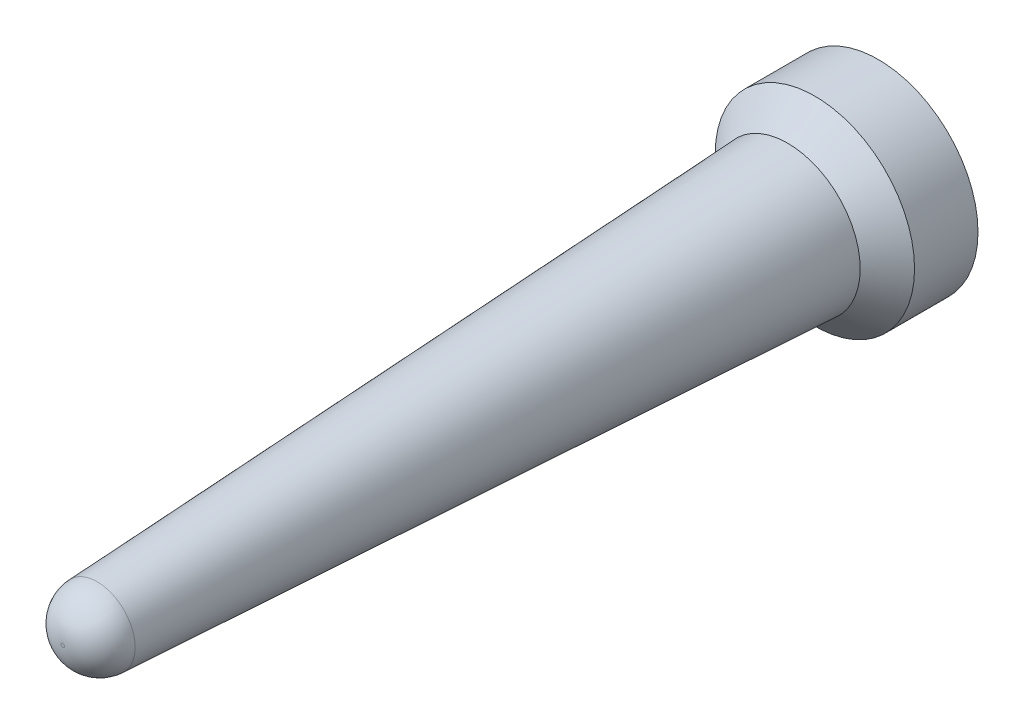
ISO-10303-21;
HEADER;
FILE_DESCRIPTION(('STEP AP214'),'2;1');
FILE_NAME('part.step','',(''),(''),'','','');
FILE_SCHEMA(('AUTOMOTIVE_DESIGN { 1 0 10303 214 1 1 1 1 }'));
ENDSEC;
DATA;
#1=APPLICATION_CONTEXT('core data for automotive mechanical design processes');
#2=APPLICATION_PROTOCOL_DEFINITION('international standard','automotive_design',2000,#1);
#3=PRODUCT_CONTEXT('',#1,'mechanical');
#4=PRODUCT('Part','Part','',(#3));
#5=PRODUCT_RELATED_PRODUCT_CATEGORY('part','',(#4));
#6=PRODUCT_DEFINITION_FORMATION('','',#4);
#7=PRODUCT_DEFINITION_CONTEXT('part definition',#1,'design');
#8=PRODUCT_DEFINITION('design','',#6,#7);
#9=PRODUCT_DEFINITION_SHAPE('','',#8);
#10=(LENGTH_UNIT() NAMED_UNIT(*) SI_UNIT(.MILLI.,.METRE.));
#11=(NAMED_UNIT(*) PLANE_ANGLE_UNIT() SI_UNIT($,.RADIAN.));
#12=(NAMED_UNIT(*) SI_UNIT($,.STERADIAN.) SOLID_ANGLE_UNIT());
#13=UNCERTAINTY_MEASURE_WITH_UNIT(LENGTH_MEASURE(1.E-05),#10,'distance_accuracy_value','');
#14=(GEOMETRIC_REPRESENTATION_CONTEXT(3) GLOBAL_UNCERTAINTY_ASSIGNED_CONTEXT((#13)) GLOBAL_UNIT_ASSIGNED_CONTEXT((#10,
#11,#12)) REPRESENTATION_CONTEXT('',''));
#15=CARTESIAN_POINT('',(0.,0.,0.));
#16=DIRECTION('',(0.,0.,1.));
#17=DIRECTION('',(1.,0.,0.));
#18=AXIS2_PLACEMENT_3D('',#15,#16,#17);
#19=CARTESIAN_POINT('',(0.,0.,0.));
#20=DIRECTION('',(0.,0.,-1.));
#21=DIRECTION('',(-1.,0.,0.));
#22=AXIS2_PLACEMENT_3D('',#19,#20,#21);
#23=PLANE('',#22);
#24=CARTESIAN_POINT('',(0.,0.,0.));
#25=DIRECTION('',(0.,0.,1.));
#26=DIRECTION('',(1.,0.,0.));
#27=AXIS2_PLACEMENT_3D('',#24,#25,#26);
#28=CIRCLE('',#27,0.2794);
#29=CARTESIAN_POINT('',(0.2794,0.,0.));
#30=VERTEX_POINT('',#29);
#31=EDGE_CURVE('E10',#30,#30,#28,.T.);
#32=ORIENTED_EDGE('',*,*,#31,.F.);
#33=EDGE_LOOP('',(#32));
#34=FACE_BOUND('',#33,.T.);
#35=ADVANCED_FACE('F35',(#34),#23,.T.);
#36=CARTESIAN_POINT('',(0.,0.,2.286));
#37=DIRECTION('',(0.,0.,1.));
#38=DIRECTION('',(1.,0.,0.));
#39=AXIS2_PLACEMENT_3D('',#36,#37,#38);
#40=CYLINDRICAL_SURFACE('',#39,0.2794);
#41=ORIENTED_EDGE('',*,*,#31,.T.);
#42=EDGE_LOOP('',(#41));
#43=FACE_BOUND('',#42,.T.);
#44=CARTESIAN_POINT('',(0.,0.,0.1778));
#45=DIRECTION('',(0.,0.,1.));
#46=DIRECTION('',(1.,0.,0.));
#47=AXIS2_PLACEMENT_3D('',#44,#45,#46);
#48=CIRCLE('',#47,0.2794);
#49=CARTESIAN_POINT('',(0.2794,0.,0.1778));
#50=VERTEX_POINT('',#49);
#51=EDGE_CURVE('E41',#50,#50,#48,.T.);
#52=ORIENTED_EDGE('',*,*,#51,.F.);
#53=EDGE_LOOP('',(#52));
#54=FACE_BOUND('',#53,.T.);
#55=ADVANCED_FACE('F74',(#43,#54),#40,.T.);
#56=CARTESIAN_POINT('',(0.,0.,0.254));
#57=DIRECTION('',(0.,0.,-1.));
#58=DIRECTION('',(-1.,0.,0.));
#59=AXIS2_PLACEMENT_3D('',#56,#57,#58);
#60=CONICAL_SURFACE('',#59,0.2032,0.785398163397447);
#61=ORIENTED_EDGE('',*,*,#51,.T.);
#62=EDGE_LOOP('',(#61));
#63=FACE_BOUND('',#62,.T.);
#64=CARTESIAN_POINT('',(0.,0.,0.254));
#65=DIRECTION('',(0.,0.,1.));
#66=DIRECTION('',(1.,0.,0.));
#67=AXIS2_PLACEMENT_3D('',#64,#65,#66);
#68=CIRCLE('',#67,0.2032);
#69=CARTESIAN_POINT('',(0.2032,0.,0.254));
#70=VERTEX_POINT('',#69);
#71=EDGE_CURVE('E45',#70,#70,#68,.T.);
#72=ORIENTED_EDGE('',*,*,#71,.F.);
#73=EDGE_LOOP('',(#72));
#74=FACE_BOUND('',#73,.T.);
#75=ADVANCED_FACE('F70',(#63,#74),#60,.T.);
#76=CARTESIAN_POINT('',(0.,0.,2.1894736618815));
#77=DIRECTION('',(0.,0.,-1.));
#78=DIRECTION('',(-1.,0.,0.));
#79=AXIS2_PLACEMENT_3D('',#76,#77,#78);
#80=CONICAL_SURFACE('',#79,0.106426316905925,0.0499583957219428);
#81=ORIENTED_EDGE('',*,*,#71,.T.);
#82=EDGE_LOOP('',(#81));
#83=FACE_BOUND('',#82,.T.);
#84=CARTESIAN_POINT('',(0.,0.,2.1894736618815));
#85=DIRECTION('',(0.,0.,1.));
#86=DIRECTION('',(1.,0.,0.));
#87=AXIS2_PLACEMENT_3D('',#84,#85,#86);
#88=CIRCLE('',#87,0.106426316905925);
#89=CARTESIAN_POINT('',(0.106426316905925,0.,2.1894736618815));
#90=VERTEX_POINT('',#89);
#91=EDGE_CURVE('E49',#90,#90,#88,.T.);
#92=ORIENTED_EDGE('',*,*,#91,.F.);
#93=EDGE_LOOP('',(#92));
#94=FACE_BOUND('',#93,.T.);
#95=ADVANCED_FACE('F62',(#83,#94),#80,.T.);
#96=CARTESIAN_POINT('',(0.,0.,2.1844));
#97=DIRECTION('',(0.,0.,1.));
#98=DIRECTION('',(1.,0.,0.));
#99=AXIS2_PLACEMENT_3D('',#96,#97,#98);
#100=DEGENERATE_TOROIDAL_SURFACE('',#99,0.00495307927593601,0.1016,.T.);
#101=ORIENTED_EDGE('',*,*,#91,.T.);
#102=EDGE_LOOP('',(#101));
#103=FACE_BOUND('',#102,.T.);
#104=CARTESIAN_POINT('',(0.,0.,2.286));
#105=DIRECTION('',(0.,0.,1.));
#106=DIRECTION('',(1.,0.,0.));
#107=AXIS2_PLACEMENT_3D('',#104,#105,#106);
#108=CIRCLE('',#107,0.00495307927593539);
#109=CARTESIAN_POINT('',(0.00495307927593539,0.,2.286));
#110=VERTEX_POINT('',#109);
#111=EDGE_CURVE('E54',#110,#110,#108,.T.);
#112=ORIENTED_EDGE('',*,*,#111,.F.);
#113=EDGE_LOOP('',(#112));
#114=FACE_BOUND('',#113,.T.);
#115=ADVANCED_FACE('F60',(#103,#114),#100,.T.);
#116=CARTESIAN_POINT('',(0.00495307927593535,0.,2.286));
#117=DIRECTION('',(0.,0.,1.));
#118=DIRECTION('',(1.,0.,0.));
#119=AXIS2_PLACEMENT_3D('',#116,#117,#118);
#120=PLANE('',#119);
#121=ORIENTED_EDGE('',*,*,#111,.T.);
#122=EDGE_LOOP('',(#121));
#123=FACE_BOUND('',#122,.T.);
#124=ADVANCED_FACE('F58',(#123),#120,.T.);
#125=CLOSED_SHELL('',(#35,#55,#75,#95,#115,#124));
#126=MANIFOLD_SOLID_BREP('B2',#125);
#127=ADVANCED_BREP_SHAPE_REPRESENTATION('',(#18,#126),#14);
#128=SHAPE_DEFINITION_REPRESENTATION(#9,#127);
ENDSEC;
END-ISO-10303-21;
